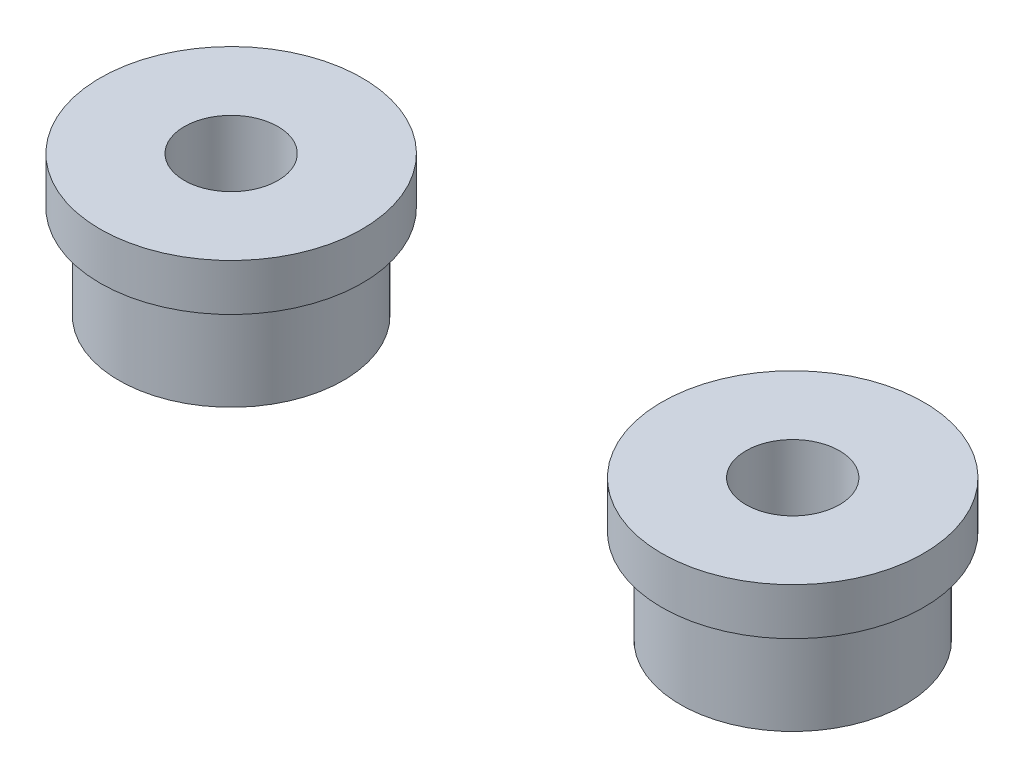
ISO-10303-21;
HEADER;
FILE_DESCRIPTION(('STEP AP214'),'2;1');
FILE_NAME('part.step','',(''),(''),'','','');
FILE_SCHEMA(('AUTOMOTIVE_DESIGN { 1 0 10303 214 1 1 1 1 }'));
ENDSEC;
DATA;
#1=APPLICATION_CONTEXT('core data for automotive mechanical design processes');
#2=APPLICATION_PROTOCOL_DEFINITION('international standard','automotive_design',2000,#1);
#3=PRODUCT_CONTEXT('',#1,'mechanical');
#4=PRODUCT('Part','Part','',(#3));
#5=PRODUCT_RELATED_PRODUCT_CATEGORY('part','',(#4));
#6=PRODUCT_DEFINITION_FORMATION('','',#4);
#7=PRODUCT_DEFINITION_CONTEXT('part definition',#1,'design');
#8=PRODUCT_DEFINITION('design','',#6,#7);
#9=PRODUCT_DEFINITION_SHAPE('','',#8);
#10=(LENGTH_UNIT() NAMED_UNIT(*) SI_UNIT(.MILLI.,.METRE.));
#11=(NAMED_UNIT(*) PLANE_ANGLE_UNIT() SI_UNIT($,.RADIAN.));
#12=(NAMED_UNIT(*) SI_UNIT($,.STERADIAN.) SOLID_ANGLE_UNIT());
#13=UNCERTAINTY_MEASURE_WITH_UNIT(LENGTH_MEASURE(1.E-05),#10,'distance_accuracy_value','');
#14=(GEOMETRIC_REPRESENTATION_CONTEXT(3) GLOBAL_UNCERTAINTY_ASSIGNED_CONTEXT((#13)) GLOBAL_UNIT_ASSIGNED_CONTEXT((#10,
#11,#12)) REPRESENTATION_CONTEXT('',''));
#15=CARTESIAN_POINT('',(0.,0.,0.));
#16=DIRECTION('',(0.,0.,1.));
#17=DIRECTION('',(1.,0.,0.));
#18=AXIS2_PLACEMENT_3D('',#15,#16,#17);
#19=CARTESIAN_POINT('',(15.,2.5,0.));
#20=DIRECTION('',(0.,1.,0.));
#21=DIRECTION('',(0.,0.,1.));
#22=AXIS2_PLACEMENT_3D('',#19,#20,#21);
#23=PLANE('',#22);
#24=CARTESIAN_POINT('',(15.,2.5,0.));
#25=DIRECTION('',(0.,1.,0.));
#26=DIRECTION('',(0.,0.,1.));
#27=AXIS2_PLACEMENT_3D('',#24,#25,#26);
#28=CIRCLE('',#27,7.);
#29=CARTESIAN_POINT('',(15.,2.5,7.));
#30=VERTEX_POINT('',#29);
#31=EDGE_CURVE('E63',#30,#30,#28,.T.);
#32=ORIENTED_EDGE('',*,*,#31,.T.);
#33=EDGE_LOOP('',(#32));
#34=FACE_BOUND('',#33,.T.);
#35=CARTESIAN_POINT('',(15.,2.5,0.));
#36=DIRECTION('',(0.,1.,0.));
#37=DIRECTION('',(0.,0.,1.));
#38=AXIS2_PLACEMENT_3D('',#35,#36,#37);
#39=CIRCLE('',#38,2.5);
#40=CARTESIAN_POINT('',(15.,2.5,2.5));
#41=VERTEX_POINT('',#40);
#42=EDGE_CURVE('E75',#41,#41,#39,.T.);
#43=ORIENTED_EDGE('',*,*,#42,.F.);
#44=EDGE_LOOP('',(#43));
#45=FACE_BOUND('',#44,.T.);
#46=ADVANCED_FACE('F55',(#34,#45),#23,.T.);
#47=CARTESIAN_POINT('',(15.,0.,0.));
#48=DIRECTION('',(0.,1.,0.));
#49=DIRECTION('',(0.,0.,1.));
#50=AXIS2_PLACEMENT_3D('',#47,#48,#49);
#51=PLANE('',#50);
#52=CARTESIAN_POINT('',(15.,0.,0.));
#53=DIRECTION('',(0.,-1.,0.));
#54=DIRECTION('',(0.,0.,-1.));
#55=AXIS2_PLACEMENT_3D('',#52,#53,#54);
#56=CIRCLE('',#55,6.);
#57=CARTESIAN_POINT('',(15.,0.,-6.));
#58=VERTEX_POINT('',#57);
#59=EDGE_CURVE('E11',#58,#58,#56,.T.);
#60=ORIENTED_EDGE('',*,*,#59,.F.);
#61=EDGE_LOOP('',(#60));
#62=FACE_BOUND('',#61,.T.);
#63=CARTESIAN_POINT('',(15.,0.,0.));
#64=DIRECTION('',(0.,1.,0.));
#65=DIRECTION('',(0.,0.,1.));
#66=AXIS2_PLACEMENT_3D('',#63,#64,#65);
#67=CIRCLE('',#66,7.);
#68=CARTESIAN_POINT('',(15.,0.,7.));
#69=VERTEX_POINT('',#68);
#70=EDGE_CURVE('E59',#69,#69,#67,.T.);
#71=ORIENTED_EDGE('',*,*,#70,.F.);
#72=EDGE_LOOP('',(#71));
#73=FACE_BOUND('',#72,.T.);
#74=ADVANCED_FACE('F83',(#62,#73),#51,.F.);
#75=CARTESIAN_POINT('',(15.,2.5,0.));
#76=DIRECTION('',(0.,-1.,0.));
#77=DIRECTION('',(0.,0.,-1.));
#78=AXIS2_PLACEMENT_3D('',#75,#76,#77);
#79=CYLINDRICAL_SURFACE('',#78,7.);
#80=ORIENTED_EDGE('',*,*,#31,.F.);
#81=EDGE_LOOP('',(#80));
#82=FACE_BOUND('',#81,.T.);
#83=ORIENTED_EDGE('',*,*,#70,.T.);
#84=EDGE_LOOP('',(#83));
#85=FACE_BOUND('',#84,.T.);
#86=ADVANCED_FACE('F57',(#82,#85),#79,.T.);
#87=CARTESIAN_POINT('',(15.,2.5,0.));
#88=DIRECTION('',(0.,-1.,0.));
#89=DIRECTION('',(0.,0.,-1.));
#90=AXIS2_PLACEMENT_3D('',#87,#88,#89);
#91=CYLINDRICAL_SURFACE('',#90,2.5);
#92=ORIENTED_EDGE('',*,*,#42,.T.);
#93=EDGE_LOOP('',(#92));
#94=FACE_BOUND('',#93,.T.);
#95=CARTESIAN_POINT('',(15.,-5.,0.));
#96=DIRECTION('',(0.,-1.,0.));
#97=DIRECTION('',(0.,0.,-1.));
#98=AXIS2_PLACEMENT_3D('',#95,#96,#97);
#99=CIRCLE('',#98,2.5);
#100=CARTESIAN_POINT('',(15.,-5.,-2.5));
#101=VERTEX_POINT('',#100);
#102=EDGE_CURVE('E72',#101,#101,#99,.T.);
#103=ORIENTED_EDGE('',*,*,#102,.T.);
#104=EDGE_LOOP('',(#103));
#105=FACE_BOUND('',#104,.T.);
#106=ADVANCED_FACE('F90',(#94,#105),#91,.F.);
#107=CARTESIAN_POINT('',(15.,-5.,0.));
#108=DIRECTION('',(0.,-1.,0.));
#109=DIRECTION('',(0.,0.,-1.));
#110=AXIS2_PLACEMENT_3D('',#107,#108,#109);
#111=PLANE('',#110);
#112=CARTESIAN_POINT('',(15.,-5.,0.));
#113=DIRECTION('',(0.,-1.,0.));
#114=DIRECTION('',(0.,0.,-1.));
#115=AXIS2_PLACEMENT_3D('',#112,#113,#114);
#116=CIRCLE('',#115,6.);
#117=CARTESIAN_POINT('',(15.,-5.,-6.));
#118=VERTEX_POINT('',#117);
#119=EDGE_CURVE('E69',#118,#118,#116,.T.);
#120=ORIENTED_EDGE('',*,*,#119,.T.);
#121=EDGE_LOOP('',(#120));
#122=FACE_BOUND('',#121,.T.);
#123=ORIENTED_EDGE('',*,*,#102,.F.);
#124=EDGE_LOOP('',(#123));
#125=FACE_BOUND('',#124,.T.);
#126=ADVANCED_FACE('F97',(#122,#125),#111,.T.);
#127=CARTESIAN_POINT('',(15.,-5.,0.));
#128=DIRECTION('',(0.,1.,0.));
#129=DIRECTION('',(0.,0.,1.));
#130=AXIS2_PLACEMENT_3D('',#127,#128,#129);
#131=CYLINDRICAL_SURFACE('',#130,6.);
#132=ORIENTED_EDGE('',*,*,#119,.F.);
#133=EDGE_LOOP('',(#132));
#134=FACE_BOUND('',#133,.T.);
#135=ORIENTED_EDGE('',*,*,#59,.T.);
#136=EDGE_LOOP('',(#135));
#137=FACE_BOUND('',#136,.T.);
#138=ADVANCED_FACE('F100',(#134,#137),#131,.T.);
#139=CLOSED_SHELL('',(#46,#74,#86,#106,#126,#138));
#140=MANIFOLD_SOLID_BREP('B2',#139);
#141=CARTESIAN_POINT('',(-15.,2.5,0.));
#142=DIRECTION('',(0.,1.,0.));
#143=DIRECTION('',(0.,0.,1.));
#144=AXIS2_PLACEMENT_3D('',#141,#142,#143);
#145=PLANE('',#144);
#146=CARTESIAN_POINT('',(-15.,2.5,0.));
#147=DIRECTION('',(0.,1.,0.));
#148=DIRECTION('',(0.,0.,1.));
#149=AXIS2_PLACEMENT_3D('',#146,#147,#148);
#150=CIRCLE('',#149,7.);
#151=CARTESIAN_POINT('',(-15.,2.5,7.));
#152=VERTEX_POINT('',#151);
#153=EDGE_CURVE('E166',#152,#152,#150,.T.);
#154=ORIENTED_EDGE('',*,*,#153,.T.);
#155=EDGE_LOOP('',(#154));
#156=FACE_BOUND('',#155,.T.);
#157=CARTESIAN_POINT('',(-15.,2.5,0.));
#158=DIRECTION('',(0.,1.,0.));
#159=DIRECTION('',(0.,0.,1.));
#160=AXIS2_PLACEMENT_3D('',#157,#158,#159);
#161=CIRCLE('',#160,2.5);
#162=CARTESIAN_POINT('',(-15.,2.5,2.5));
#163=VERTEX_POINT('',#162);
#164=EDGE_CURVE('E175',#163,#163,#161,.T.);
#165=ORIENTED_EDGE('',*,*,#164,.F.);
#166=EDGE_LOOP('',(#165));
#167=FACE_BOUND('',#166,.T.);
#168=ADVANCED_FACE('F158',(#156,#167),#145,.T.);
#169=CARTESIAN_POINT('',(-15.,0.,0.));
#170=DIRECTION('',(0.,1.,0.));
#171=DIRECTION('',(0.,0.,1.));
#172=AXIS2_PLACEMENT_3D('',#169,#170,#171);
#173=PLANE('',#172);
#174=CARTESIAN_POINT('',(-15.,0.,0.));
#175=DIRECTION('',(0.,-1.,0.));
#176=DIRECTION('',(0.,0.,-1.));
#177=AXIS2_PLACEMENT_3D('',#174,#175,#176);
#178=CIRCLE('',#177,6.);
#179=CARTESIAN_POINT('',(-15.,0.,-6.));
#180=VERTEX_POINT('',#179);
#181=EDGE_CURVE('E54',#180,#180,#178,.T.);
#182=ORIENTED_EDGE('',*,*,#181,.F.);
#183=EDGE_LOOP('',(#182));
#184=FACE_BOUND('',#183,.T.);
#185=CARTESIAN_POINT('',(-15.,0.,0.));
#186=DIRECTION('',(0.,1.,0.));
#187=DIRECTION('',(0.,0.,1.));
#188=AXIS2_PLACEMENT_3D('',#185,#186,#187);
#189=CIRCLE('',#188,7.);
#190=CARTESIAN_POINT('',(-15.,0.,7.));
#191=VERTEX_POINT('',#190);
#192=EDGE_CURVE('E162',#191,#191,#189,.T.);
#193=ORIENTED_EDGE('',*,*,#192,.F.);
#194=EDGE_LOOP('',(#193));
#195=FACE_BOUND('',#194,.T.);
#196=ADVANCED_FACE('F201',(#184,#195),#173,.F.);
#197=CARTESIAN_POINT('',(-15.,2.5,0.));
#198=DIRECTION('',(0.,-1.,0.));
#199=DIRECTION('',(0.,0.,-1.));
#200=AXIS2_PLACEMENT_3D('',#197,#198,#199);
#201=CYLINDRICAL_SURFACE('',#200,7.);
#202=ORIENTED_EDGE('',*,*,#153,.F.);
#203=EDGE_LOOP('',(#202));
#204=FACE_BOUND('',#203,.T.);
#205=ORIENTED_EDGE('',*,*,#192,.T.);
#206=EDGE_LOOP('',(#205));
#207=FACE_BOUND('',#206,.T.);
#208=ADVANCED_FACE('F160',(#204,#207),#201,.T.);
#209=CARTESIAN_POINT('',(-15.,2.5,0.));
#210=DIRECTION('',(0.,-1.,0.));
#211=DIRECTION('',(0.,0.,-1.));
#212=AXIS2_PLACEMENT_3D('',#209,#210,#211);
#213=CYLINDRICAL_SURFACE('',#212,2.5);
#214=ORIENTED_EDGE('',*,*,#164,.T.);
#215=EDGE_LOOP('',(#214));
#216=FACE_BOUND('',#215,.T.);
#217=CARTESIAN_POINT('',(-15.,-5.,0.));
#218=DIRECTION('',(0.,-1.,0.));
#219=DIRECTION('',(0.,0.,-1.));
#220=AXIS2_PLACEMENT_3D('',#217,#218,#219);
#221=CIRCLE('',#220,2.5);
#222=CARTESIAN_POINT('',(-15.,-5.,-2.5));
#223=VERTEX_POINT('',#222);
#224=EDGE_CURVE('E181',#223,#223,#221,.T.);
#225=ORIENTED_EDGE('',*,*,#224,.T.);
#226=EDGE_LOOP('',(#225));
#227=FACE_BOUND('',#226,.T.);
#228=ADVANCED_FACE('F187',(#216,#227),#213,.F.);
#229=CARTESIAN_POINT('',(-15.,-5.,0.));
#230=DIRECTION('',(0.,-1.,0.));
#231=DIRECTION('',(0.,0.,-1.));
#232=AXIS2_PLACEMENT_3D('',#229,#230,#231);
#233=PLANE('',#232);
#234=CARTESIAN_POINT('',(-15.,-5.,0.));
#235=DIRECTION('',(0.,-1.,0.));
#236=DIRECTION('',(0.,0.,-1.));
#237=AXIS2_PLACEMENT_3D('',#234,#235,#236);
#238=CIRCLE('',#237,6.);
#239=CARTESIAN_POINT('',(-15.,-5.,-6.));
#240=VERTEX_POINT('',#239);
#241=EDGE_CURVE('E173',#240,#240,#238,.T.);
#242=ORIENTED_EDGE('',*,*,#241,.T.);
#243=EDGE_LOOP('',(#242));
#244=FACE_BOUND('',#243,.T.);
#245=ORIENTED_EDGE('',*,*,#224,.F.);
#246=EDGE_LOOP('',(#245));
#247=FACE_BOUND('',#246,.T.);
#248=ADVANCED_FACE('F189',(#244,#247),#233,.T.);
#249=CARTESIAN_POINT('',(-15.,-5.,0.));
#250=DIRECTION('',(0.,1.,0.));
#251=DIRECTION('',(0.,0.,1.));
#252=AXIS2_PLACEMENT_3D('',#249,#250,#251);
#253=CYLINDRICAL_SURFACE('',#252,6.);
#254=ORIENTED_EDGE('',*,*,#241,.F.);
#255=EDGE_LOOP('',(#254));
#256=FACE_BOUND('',#255,.T.);
#257=ORIENTED_EDGE('',*,*,#181,.T.);
#258=EDGE_LOOP('',(#257));
#259=FACE_BOUND('',#258,.T.);
#260=ADVANCED_FACE('F191',(#256,#259),#253,.T.);
#261=CLOSED_SHELL('',(#168,#196,#208,#228,#248,#260));
#262=MANIFOLD_SOLID_BREP('B6',#261);
#263=ADVANCED_BREP_SHAPE_REPRESENTATION('',(#18,#140,#262),#14);
#264=SHAPE_DEFINITION_REPRESENTATION(#9,#263);
ENDSEC;
END-ISO-10303-21;
